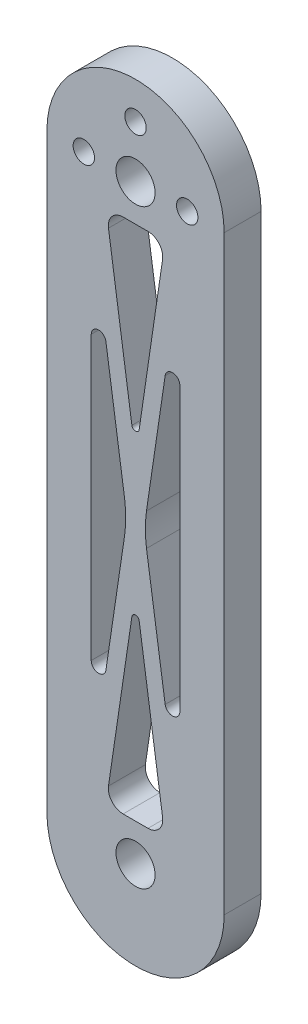
ISO-10303-21;
HEADER;
FILE_DESCRIPTION(('STEP AP214'),'2;1');
FILE_NAME('part.step','',(''),(''),'','','');
FILE_SCHEMA(('AUTOMOTIVE_DESIGN { 1 0 10303 214 1 1 1 1 }'));
ENDSEC;
DATA;
#1=APPLICATION_CONTEXT('core data for automotive mechanical design processes');
#2=APPLICATION_PROTOCOL_DEFINITION('international standard','automotive_design',2000,#1);
#3=PRODUCT_CONTEXT('',#1,'mechanical');
#4=PRODUCT('Part','Part','',(#3));
#5=PRODUCT_RELATED_PRODUCT_CATEGORY('part','',(#4));
#6=PRODUCT_DEFINITION_FORMATION('','',#4);
#7=PRODUCT_DEFINITION_CONTEXT('part definition',#1,'design');
#8=PRODUCT_DEFINITION('design','',#6,#7);
#9=PRODUCT_DEFINITION_SHAPE('','',#8);
#10=(LENGTH_UNIT() NAMED_UNIT(*) SI_UNIT(.MILLI.,.METRE.));
#11=(NAMED_UNIT(*) PLANE_ANGLE_UNIT() SI_UNIT($,.RADIAN.));
#12=(NAMED_UNIT(*) SI_UNIT($,.STERADIAN.) SOLID_ANGLE_UNIT());
#13=UNCERTAINTY_MEASURE_WITH_UNIT(LENGTH_MEASURE(1.E-05),#10,'distance_accuracy_value','');
#14=(GEOMETRIC_REPRESENTATION_CONTEXT(3) GLOBAL_UNCERTAINTY_ASSIGNED_CONTEXT((#13)) GLOBAL_UNIT_ASSIGNED_CONTEXT((#10,
#11,#12)) REPRESENTATION_CONTEXT('',''));
#15=CARTESIAN_POINT('',(0.,0.,0.));
#16=DIRECTION('',(0.,0.,1.));
#17=DIRECTION('',(1.,0.,0.));
#18=AXIS2_PLACEMENT_3D('',#15,#16,#17);
#19=CARTESIAN_POINT('',(0.,-40.,5.));
#20=DIRECTION('',(0.,0.,1.));
#21=DIRECTION('',(1.,0.,0.));
#22=AXIS2_PLACEMENT_3D('',#19,#20,#21);
#23=PLANE('',#22);
#24=CARTESIAN_POINT('',(-7.,40.,5.));
#25=DIRECTION('',(0.,0.,1.));
#26=DIRECTION('',(1.,0.,0.));
#27=AXIS2_PLACEMENT_3D('',#24,#25,#26);
#28=CIRCLE('',#27,1.45);
#29=CARTESIAN_POINT('',(-5.55,40.,5.));
#30=VERTEX_POINT('',#29);
#31=EDGE_CURVE('E411',#30,#30,#28,.T.);
#32=ORIENTED_EDGE('',*,*,#31,.F.);
#33=EDGE_LOOP('',(#32));
#34=FACE_BOUND('',#33,.T.);
#35=CARTESIAN_POINT('',(0.,-40.,5.));
#36=DIRECTION('',(0.,0.,1.));
#37=DIRECTION('',(1.,0.,0.));
#38=AXIS2_PLACEMENT_3D('',#35,#36,#37);
#39=CIRCLE('',#38,2.65);
#40=CARTESIAN_POINT('',(2.65,-40.,5.));
#41=VERTEX_POINT('',#40);
#42=EDGE_CURVE('E423',#41,#41,#39,.T.);
#43=ORIENTED_EDGE('',*,*,#42,.F.);
#44=EDGE_LOOP('',(#43));
#45=FACE_BOUND('',#44,.T.);
#46=CARTESIAN_POINT('',(0.,-40.,5.));
#47=DIRECTION('',(0.,0.,1.));
#48=DIRECTION('',(1.,0.,0.));
#49=AXIS2_PLACEMENT_3D('',#46,#47,#48);
#50=CIRCLE('',#49,12.);
#51=CARTESIAN_POINT('',(-12.,-40.,5.));
#52=VERTEX_POINT('',#51);
#53=CARTESIAN_POINT('',(12.,-40.,5.));
#54=VERTEX_POINT('',#53);
#55=EDGE_CURVE('E435',#52,#54,#50,.T.);
#56=ORIENTED_EDGE('',*,*,#55,.T.);
#57=DIRECTION('',(0.,1.,0.));
#58=VECTOR('',#57,1.);
#59=CARTESIAN_POINT('',(12.,40.,5.));
#60=LINE('',#59,#58);
#61=CARTESIAN_POINT('',(12.,40.,5.));
#62=VERTEX_POINT('',#61);
#63=EDGE_CURVE('E438',#54,#62,#60,.T.);
#64=ORIENTED_EDGE('',*,*,#63,.T.);
#65=CARTESIAN_POINT('',(0.,40.,5.));
#66=DIRECTION('',(0.,0.,1.));
#67=DIRECTION('',(1.,0.,0.));
#68=AXIS2_PLACEMENT_3D('',#65,#66,#67);
#69=CIRCLE('',#68,12.);
#70=CARTESIAN_POINT('',(-12.,40.,5.));
#71=VERTEX_POINT('',#70);
#72=EDGE_CURVE('E441',#62,#71,#69,.T.);
#73=ORIENTED_EDGE('',*,*,#72,.T.);
#74=DIRECTION('',(0.,-1.,0.));
#75=VECTOR('',#74,1.);
#76=CARTESIAN_POINT('',(-12.,40.,5.));
#77=LINE('',#76,#75);
#78=EDGE_CURVE('E443',#71,#52,#77,.T.);
#79=ORIENTED_EDGE('',*,*,#78,.T.);
#80=EDGE_LOOP('',(#56,#64,#73,#79));
#81=FACE_BOUND('',#80,.T.);
#82=CARTESIAN_POINT('',(0.,40.,5.));
#83=DIRECTION('',(0.,0.,1.));
#84=DIRECTION('',(1.,0.,0.));
#85=AXIS2_PLACEMENT_3D('',#82,#83,#84);
#86=CIRCLE('',#85,2.65);
#87=CARTESIAN_POINT('',(2.65,40.,5.));
#88=VERTEX_POINT('',#87);
#89=EDGE_CURVE('E429',#88,#88,#86,.T.);
#90=ORIENTED_EDGE('',*,*,#89,.F.);
#91=EDGE_LOOP('',(#90));
#92=FACE_BOUND('',#91,.T.);
#93=CARTESIAN_POINT('',(7.,40.,5.));
#94=DIRECTION('',(0.,0.,1.));
#95=DIRECTION('',(1.,0.,0.));
#96=AXIS2_PLACEMENT_3D('',#93,#94,#95);
#97=CIRCLE('',#96,1.45);
#98=CARTESIAN_POINT('',(8.45,40.,5.));
#99=VERTEX_POINT('',#98);
#100=EDGE_CURVE('E417',#99,#99,#97,.T.);
#101=ORIENTED_EDGE('',*,*,#100,.F.);
#102=EDGE_LOOP('',(#101));
#103=FACE_BOUND('',#102,.T.);
#104=CARTESIAN_POINT('',(0.,47.,5.));
#105=DIRECTION('',(0.,0.,1.));
#106=DIRECTION('',(1.,0.,0.));
#107=AXIS2_PLACEMENT_3D('',#104,#105,#106);
#108=CIRCLE('',#107,1.45);
#109=CARTESIAN_POINT('',(1.45,47.,5.));
#110=VERTEX_POINT('',#109);
#111=EDGE_CURVE('E405',#110,#110,#108,.T.);
#112=ORIENTED_EDGE('',*,*,#111,.F.);
#113=EDGE_LOOP('',(#112));
#114=FACE_BOUND('',#113,.T.);
#115=DIRECTION('',(0.,1.,0.));
#116=VECTOR('',#115,1.);
#117=CARTESIAN_POINT('',(6.00000000000021,19.0957813446483,5.));
#118=LINE('',#117,#116);
#119=CARTESIAN_POINT('',(6.00000000000005,-19.1632564122171,5.));
#120=VERTEX_POINT('',#119);
#121=CARTESIAN_POINT('',(6.0000000000002,19.0957813446483,5.));
#122=VERTEX_POINT('',#121);
#123=EDGE_CURVE('E362',#120,#122,#118,.T.);
#124=ORIENTED_EDGE('',*,*,#123,.F.);
#125=CARTESIAN_POINT('',(5.00000000000005,-19.1632564122178,5.));
#126=DIRECTION('',(0.,0.,1.));
#127=DIRECTION('',(1.,0.,0.));
#128=AXIS2_PLACEMENT_3D('',#125,#126,#127);
#129=CIRCLE('',#128,0.99999999999992);
#130=CARTESIAN_POINT('',(4.01084286011318,-19.3101174097989,5.));
#131=VERTEX_POINT('',#130);
#132=EDGE_CURVE('E360',#131,#120,#129,.T.);
#133=ORIENTED_EDGE('',*,*,#132,.F.);
#134=DIRECTION('',(0.14686099758108,-0.98915713988703,0.));
#135=VECTOR('',#134,1.);
#136=CARTESIAN_POINT('',(4.01084286011318,-19.3101174097989,5.));
#137=LINE('',#136,#135);
#138=CARTESIAN_POINT('',(1.48241939604228,-2.28035346064101,5.));
#139=VERTEX_POINT('',#138);
#140=EDGE_CURVE('E372',#139,#131,#137,.T.);
#141=ORIENTED_EDGE('',*,*,#140,.F.);
#142=CARTESIAN_POINT('',(16.3197764943478,-0.0774384969248615,5.));
#143=DIRECTION('',(0.,0.,1.));
#144=DIRECTION('',(-1.,0.,0.));
#145=AXIS2_PLACEMENT_3D('',#142,#143,#144);
#146=CIRCLE('',#145,15.);
#147=CARTESIAN_POINT('',(1.48078976209683,2.11447225857628,5.));
#148=VERTEX_POINT('',#147);
#149=EDGE_CURVE('E369',#148,#139,#146,.T.);
#150=ORIENTED_EDGE('',*,*,#149,.F.);
#151=DIRECTION('',(-0.146127383700074,-0.989265782150061,0.));
#152=VECTOR('',#151,1.);
#153=CARTESIAN_POINT('',(4.01073421785015,19.2419087283484,5.));
#154=LINE('',#153,#152);
#155=CARTESIAN_POINT('',(4.01073421785015,19.2419087283484,5.));
#156=VERTEX_POINT('',#155);
#157=EDGE_CURVE('E367',#156,#148,#154,.T.);
#158=ORIENTED_EDGE('',*,*,#157,.F.);
#159=CARTESIAN_POINT('',(5.0000000000002,19.0957813446483,5.));
#160=DIRECTION('',(0.,0.,1.));
#161=DIRECTION('',(-1.,0.,0.));
#162=AXIS2_PLACEMENT_3D('',#159,#160,#161);
#163=CIRCLE('',#162,1.);
#164=EDGE_CURVE('E365',#122,#156,#163,.T.);
#165=ORIENTED_EDGE('',*,*,#164,.F.);
#166=EDGE_LOOP('',(#124,#133,#141,#150,#158,#165));
#167=FACE_BOUND('',#166,.T.);
#168=DIRECTION('',(0.14686099758049,0.989157139887118,0.));
#169=VECTOR('',#168,1.);
#170=CARTESIAN_POINT('',(-1.48241939605015,-2.28035346057146,5.));
#171=LINE('',#170,#169);
#172=CARTESIAN_POINT('',(-4.01084286011281,-19.3101174097437,5.));
#173=VERTEX_POINT('',#172);
#174=CARTESIAN_POINT('',(-1.48241939605014,-2.28035346057146,5.));
#175=VERTEX_POINT('',#174);
#176=EDGE_CURVE('E317',#173,#175,#171,.T.);
#177=ORIENTED_EDGE('',*,*,#176,.F.);
#178=CARTESIAN_POINT('',(-5.00000000000002,-19.1632564121639,5.));
#179=DIRECTION('',(0.,0.,1.));
#180=DIRECTION('',(1.,0.,0.));
#181=AXIS2_PLACEMENT_3D('',#178,#179,#180);
#182=CIRCLE('',#181,1.);
#183=CARTESIAN_POINT('',(-6.00000000000002,-19.1632564121632,5.));
#184=VERTEX_POINT('',#183);
#185=EDGE_CURVE('E315',#184,#173,#182,.T.);
#186=ORIENTED_EDGE('',*,*,#185,.F.);
#187=DIRECTION('',(0.,-1.,0.));
#188=VECTOR('',#187,1.);
#189=CARTESIAN_POINT('',(-6.00000000000002,-19.1632564121632,5.));
#190=LINE('',#189,#188);
#191=CARTESIAN_POINT('',(-6.00000000000027,19.0957813446471,5.));
#192=VERTEX_POINT('',#191);
#193=EDGE_CURVE('E327',#192,#184,#190,.T.);
#194=ORIENTED_EDGE('',*,*,#193,.F.);
#195=CARTESIAN_POINT('',(-5.00000000000027,19.0957813446478,5.));
#196=DIRECTION('',(0.,0.,1.));
#197=DIRECTION('',(-1.,0.,0.));
#198=AXIS2_PLACEMENT_3D('',#195,#196,#197);
#199=CIRCLE('',#198,1.00000000000012);
#200=CARTESIAN_POINT('',(-4.01073421785008,19.2419087283478,5.));
#201=VERTEX_POINT('',#200);
#202=EDGE_CURVE('E324',#201,#192,#199,.T.);
#203=ORIENTED_EDGE('',*,*,#202,.F.);
#204=DIRECTION('',(-0.146127383700058,0.989265782150063,0.));
#205=VECTOR('',#204,1.);
#206=CARTESIAN_POINT('',(-1.48078976210594,2.11447225863689,5.));
#207=LINE('',#206,#205);
#208=CARTESIAN_POINT('',(-1.48078976210594,2.11447225863689,5.));
#209=VERTEX_POINT('',#208);
#210=EDGE_CURVE('E322',#209,#201,#207,.T.);
#211=ORIENTED_EDGE('',*,*,#210,.F.);
#212=CARTESIAN_POINT('',(-16.3197764943568,-0.077438496863992,5.));
#213=DIRECTION('',(0.,0.,1.));
#214=DIRECTION('',(1.,0.,0.));
#215=AXIS2_PLACEMENT_3D('',#212,#213,#214);
#216=CIRCLE('',#215,14.9999999999999);
#217=EDGE_CURVE('E320',#175,#209,#216,.T.);
#218=ORIENTED_EDGE('',*,*,#217,.F.);
#219=EDGE_LOOP('',(#177,#186,#194,#203,#211,#218));
#220=FACE_BOUND('',#219,.T.);
#221=DIRECTION('',(1.,0.,0.));
#222=VECTOR('',#221,1.);
#223=CARTESIAN_POINT('',(-1.6843717320659,-35.,5.));
#224=LINE('',#223,#222);
#225=CARTESIAN_POINT('',(-1.6843717320659,-35.,5.));
#226=VERTEX_POINT('',#225);
#227=CARTESIAN_POINT('',(1.6843717320659,-35.,5.));
#228=VERTEX_POINT('',#227);
#229=EDGE_CURVE('E272',#226,#228,#224,.T.);
#230=ORIENTED_EDGE('',*,*,#229,.F.);
#231=CARTESIAN_POINT('',(-1.68437173206592,-33.,5.));
#232=DIRECTION('',(0.,0.,1.));
#233=DIRECTION('',(-1.,0.,0.));
#234=AXIS2_PLACEMENT_3D('',#231,#232,#233);
#235=CIRCLE('',#234,2.0000000000002);
#236=CARTESIAN_POINT('',(-3.66290329636644,-32.7077452325998,5.));
#237=VERTEX_POINT('',#236);
#238=EDGE_CURVE('E270',#237,#226,#235,.T.);
#239=ORIENTED_EDGE('',*,*,#238,.F.);
#240=DIRECTION('',(-0.146127383700074,-0.989265782150061,0.));
#241=VECTOR('',#240,1.);
#242=CARTESIAN_POINT('',(-0.494632891075225,-11.2589146219979,5.));
#243=LINE('',#242,#241);
#244=CARTESIAN_POINT('',(-0.494632891075229,-11.2589146219979,5.));
#245=VERTEX_POINT('',#244);
#246=EDGE_CURVE('E282',#245,#237,#243,.T.);
#247=ORIENTED_EDGE('',*,*,#246,.F.);
#248=CARTESIAN_POINT('',(0.,-11.3319783138479,5.));
#249=DIRECTION('',(0.,0.,1.));
#250=DIRECTION('',(-1.,0.,0.));
#251=AXIS2_PLACEMENT_3D('',#248,#249,#250);
#252=CIRCLE('',#251,0.499999999999972);
#253=CARTESIAN_POINT('',(0.49463289107479,-11.2589146219979,5.));
#254=VERTEX_POINT('',#253);
#255=EDGE_CURVE('E279',#254,#245,#252,.T.);
#256=ORIENTED_EDGE('',*,*,#255,.F.);
#257=DIRECTION('',(-0.146127383700057,0.989265782150063,0.));
#258=VECTOR('',#257,1.);
#259=CARTESIAN_POINT('',(0.49463289107479,-11.2589146219979,5.));
#260=LINE('',#259,#258);
#261=CARTESIAN_POINT('',(3.66290329636585,-32.7077452325999,5.));
#262=VERTEX_POINT('',#261);
#263=EDGE_CURVE('E277',#262,#254,#260,.T.);
#264=ORIENTED_EDGE('',*,*,#263,.F.);
#265=CARTESIAN_POINT('',(1.68437173206592,-33.,5.));
#266=DIRECTION('',(0.,0.,1.));
#267=DIRECTION('',(-1.,0.,0.));
#268=AXIS2_PLACEMENT_3D('',#265,#266,#267);
#269=CIRCLE('',#268,1.99999999999981);
#270=EDGE_CURVE('E275',#228,#262,#269,.T.);
#271=ORIENTED_EDGE('',*,*,#270,.F.);
#272=EDGE_LOOP('',(#230,#239,#247,#256,#264,#271));
#273=FACE_BOUND('',#272,.T.);
#274=DIRECTION('',(0.145493990494669,-0.989359135364877,0.));
#275=VECTOR('',#274,1.);
#276=CARTESIAN_POINT('',(-3.66309000279215,32.7090120190112,5.));
#277=LINE('',#276,#275);
#278=CARTESIAN_POINT('',(-3.66309000279215,32.7090120190112,5.));
#279=VERTEX_POINT('',#278);
#280=CARTESIAN_POINT('',(-0.494679567682443,11.1638210602406,5.));
#281=VERTEX_POINT('',#280);
#282=EDGE_CURVE('E227',#279,#281,#277,.T.);
#283=ORIENTED_EDGE('',*,*,#282,.F.);
#284=CARTESIAN_POINT('',(-1.6843717320624,33.0000000000005,5.));
#285=DIRECTION('',(0.,0.,1.));
#286=DIRECTION('',(-1.,0.,0.));
#287=AXIS2_PLACEMENT_3D('',#284,#285,#286);
#288=CIRCLE('',#287,1.99999999999974);
#289=CARTESIAN_POINT('',(-1.6843717320624,35.,5.));
#290=VERTEX_POINT('',#289);
#291=EDGE_CURVE('E219',#290,#279,#288,.T.);
#292=ORIENTED_EDGE('',*,*,#291,.F.);
#293=DIRECTION('',(-1.,0.,0.));
#294=VECTOR('',#293,1.);
#295=CARTESIAN_POINT('',(-1.6843717320624,35.,5.));
#296=LINE('',#295,#294);
#297=CARTESIAN_POINT('',(1.6843717320624,35.,5.));
#298=VERTEX_POINT('',#297);
#299=EDGE_CURVE('E248',#298,#290,#296,.T.);
#300=ORIENTED_EDGE('',*,*,#299,.F.);
#301=CARTESIAN_POINT('',(1.6843717320624,33.0000000000005,5.));
#302=DIRECTION('',(0.,0.,1.));
#303=DIRECTION('',(1.,0.,0.));
#304=AXIS2_PLACEMENT_3D('',#301,#302,#303);
#305=CIRCLE('',#304,1.99999999999974);
#306=CARTESIAN_POINT('',(3.66309000279214,32.7090120190112,5.));
#307=VERTEX_POINT('',#306);
#308=EDGE_CURVE('E246',#307,#298,#305,.T.);
#309=ORIENTED_EDGE('',*,*,#308,.F.);
#310=DIRECTION('',(0.145493990494669,0.989359135364877,0.));
#311=VECTOR('',#310,1.);
#312=CARTESIAN_POINT('',(3.66309000279214,32.7090120190112,5.));
#313=LINE('',#312,#311);
#314=CARTESIAN_POINT('',(0.494679567682434,11.1638210602406,5.));
#315=VERTEX_POINT('',#314);
#316=EDGE_CURVE('E242',#315,#307,#313,.T.);
#317=ORIENTED_EDGE('',*,*,#316,.F.);
#318=CARTESIAN_POINT('',(0.,11.2365680554879,5.));
#319=DIRECTION('',(0.,0.,1.));
#320=DIRECTION('',(1.,0.,0.));
#321=AXIS2_PLACEMENT_3D('',#318,#319,#320);
#322=CIRCLE('',#321,0.5);
#323=EDGE_CURVE('E240',#281,#315,#322,.T.);
#324=ORIENTED_EDGE('',*,*,#323,.F.);
#325=EDGE_LOOP('',(#283,#292,#300,#309,#317,#324));
#326=FACE_BOUND('',#325,.T.);
#327=ADVANCED_FACE('F34',(#34,#45,#81,#92,#103,#114,#167,#220,#273,#326),#23,.T.);
#328=CARTESIAN_POINT('',(0.,-40.,0.));
#329=DIRECTION('',(0.,0.,1.));
#330=DIRECTION('',(1.,0.,0.));
#331=AXIS2_PLACEMENT_3D('',#328,#329,#330);
#332=PLANE('',#331);
#333=CARTESIAN_POINT('',(-1.68437173206592,-33.,0.));
#334=DIRECTION('',(0.,0.,1.));
#335=DIRECTION('',(-1.,0.,0.));
#336=AXIS2_PLACEMENT_3D('',#333,#334,#335);
#337=CIRCLE('',#336,2.0000000000002);
#338=CARTESIAN_POINT('',(-3.66290329636644,-32.7077452325998,0.));
#339=VERTEX_POINT('',#338);
#340=CARTESIAN_POINT('',(-1.6843717320659,-35.,0.));
#341=VERTEX_POINT('',#340);
#342=EDGE_CURVE('E235',#339,#341,#337,.T.);
#343=ORIENTED_EDGE('',*,*,#342,.T.);
#344=DIRECTION('',(1.,0.,0.));
#345=VECTOR('',#344,1.);
#346=CARTESIAN_POINT('',(-1.6843717320659,-35.,0.));
#347=LINE('',#346,#345);
#348=CARTESIAN_POINT('',(1.6843717320659,-35.,0.));
#349=VERTEX_POINT('',#348);
#350=EDGE_CURVE('E287',#341,#349,#347,.T.);
#351=ORIENTED_EDGE('',*,*,#350,.T.);
#352=CARTESIAN_POINT('',(1.68437173206592,-33.,0.));
#353=DIRECTION('',(0.,0.,1.));
#354=DIRECTION('',(-1.,0.,0.));
#355=AXIS2_PLACEMENT_3D('',#352,#353,#354);
#356=CIRCLE('',#355,1.99999999999981);
#357=CARTESIAN_POINT('',(3.66290329636585,-32.7077452325999,0.));
#358=VERTEX_POINT('',#357);
#359=EDGE_CURVE('E290',#349,#358,#356,.T.);
#360=ORIENTED_EDGE('',*,*,#359,.T.);
#361=DIRECTION('',(-0.146127383700057,0.989265782150063,0.));
#362=VECTOR('',#361,1.);
#363=CARTESIAN_POINT('',(0.49463289107479,-11.2589146219979,0.));
#364=LINE('',#363,#362);
#365=CARTESIAN_POINT('',(0.49463289107479,-11.2589146219979,0.));
#366=VERTEX_POINT('',#365);
#367=EDGE_CURVE('E293',#358,#366,#364,.T.);
#368=ORIENTED_EDGE('',*,*,#367,.T.);
#369=CARTESIAN_POINT('',(0.,-11.3319783138479,0.));
#370=DIRECTION('',(0.,0.,1.));
#371=DIRECTION('',(-1.,0.,0.));
#372=AXIS2_PLACEMENT_3D('',#369,#370,#371);
#373=CIRCLE('',#372,0.499999999999972);
#374=CARTESIAN_POINT('',(-0.494632891075011,-11.2589146219979,0.));
#375=VERTEX_POINT('',#374);
#376=EDGE_CURVE('E296',#366,#375,#373,.T.);
#377=ORIENTED_EDGE('',*,*,#376,.T.);
#378=DIRECTION('',(-0.146127383700074,-0.989265782150061,0.));
#379=VECTOR('',#378,1.);
#380=CARTESIAN_POINT('',(-0.494632891075225,-11.2589146219979,0.));
#381=LINE('',#380,#379);
#382=EDGE_CURVE('E273',#375,#339,#381,.T.);
#383=ORIENTED_EDGE('',*,*,#382,.T.);
#384=EDGE_LOOP('',(#343,#351,#360,#368,#377,#383));
#385=FACE_BOUND('',#384,.T.);
#386=CARTESIAN_POINT('',(5.00000000000005,-19.1632564122178,0.));
#387=DIRECTION('',(0.,0.,1.));
#388=DIRECTION('',(1.,0.,0.));
#389=AXIS2_PLACEMENT_3D('',#386,#387,#388);
#390=CIRCLE('',#389,0.99999999999992);
#391=CARTESIAN_POINT('',(4.01084286011318,-19.3101174097989,0.));
#392=VERTEX_POINT('',#391);
#393=CARTESIAN_POINT('',(6.00000000000005,-19.1632564122171,0.));
#394=VERTEX_POINT('',#393);
#395=EDGE_CURVE('E359',#392,#394,#390,.T.);
#396=ORIENTED_EDGE('',*,*,#395,.T.);
#397=DIRECTION('',(0.,1.,0.));
#398=VECTOR('',#397,1.);
#399=CARTESIAN_POINT('',(6.00000000000021,19.0957813446483,0.));
#400=LINE('',#399,#398);
#401=CARTESIAN_POINT('',(6.0000000000002,19.0957813446483,0.));
#402=VERTEX_POINT('',#401);
#403=EDGE_CURVE('E377',#394,#402,#400,.T.);
#404=ORIENTED_EDGE('',*,*,#403,.T.);
#405=CARTESIAN_POINT('',(5.0000000000002,19.0957813446483,0.));
#406=DIRECTION('',(0.,0.,1.));
#407=DIRECTION('',(-1.,0.,0.));
#408=AXIS2_PLACEMENT_3D('',#405,#406,#407);
#409=CIRCLE('',#408,1.);
#410=CARTESIAN_POINT('',(4.01073421785015,19.2419087283484,0.));
#411=VERTEX_POINT('',#410);
#412=EDGE_CURVE('E380',#402,#411,#409,.T.);
#413=ORIENTED_EDGE('',*,*,#412,.T.);
#414=DIRECTION('',(-0.146127383700074,-0.989265782150061,0.));
#415=VECTOR('',#414,1.);
#416=CARTESIAN_POINT('',(4.01073421785015,19.2419087283484,0.));
#417=LINE('',#416,#415);
#418=CARTESIAN_POINT('',(1.48078976209683,2.11447225857628,0.));
#419=VERTEX_POINT('',#418);
#420=EDGE_CURVE('E383',#411,#419,#417,.T.);
#421=ORIENTED_EDGE('',*,*,#420,.T.);
#422=CARTESIAN_POINT('',(16.3197764943478,-0.0774384969248615,0.));
#423=DIRECTION('',(0.,0.,1.));
#424=DIRECTION('',(-1.,0.,0.));
#425=AXIS2_PLACEMENT_3D('',#422,#423,#424);
#426=CIRCLE('',#425,15.);
#427=CARTESIAN_POINT('',(1.48241939604228,-2.28035346064102,0.));
#428=VERTEX_POINT('',#427);
#429=EDGE_CURVE('E386',#419,#428,#426,.T.);
#430=ORIENTED_EDGE('',*,*,#429,.T.);
#431=DIRECTION('',(0.14686099758108,-0.98915713988703,0.));
#432=VECTOR('',#431,1.);
#433=CARTESIAN_POINT('',(4.01084286011318,-19.3101174097989,0.));
#434=LINE('',#433,#432);
#435=EDGE_CURVE('E363',#428,#392,#434,.T.);
#436=ORIENTED_EDGE('',*,*,#435,.T.);
#437=EDGE_LOOP('',(#396,#404,#413,#421,#430,#436));
#438=FACE_BOUND('',#437,.T.);
#439=CARTESIAN_POINT('',(0.,-40.,0.));
#440=DIRECTION('',(0.,0.,1.));
#441=DIRECTION('',(1.,0.,0.));
#442=AXIS2_PLACEMENT_3D('',#439,#440,#441);
#443=CIRCLE('',#442,12.);
#444=CARTESIAN_POINT('',(-12.,-40.,0.));
#445=VERTEX_POINT('',#444);
#446=CARTESIAN_POINT('',(12.,-40.,0.));
#447=VERTEX_POINT('',#446);
#448=EDGE_CURVE('E432',#445,#447,#443,.T.);
#449=ORIENTED_EDGE('',*,*,#448,.F.);
#450=DIRECTION('',(0.,-1.,0.));
#451=VECTOR('',#450,1.);
#452=CARTESIAN_POINT('',(-12.,40.,0.));
#453=LINE('',#452,#451);
#454=CARTESIAN_POINT('',(-12.,40.,0.));
#455=VERTEX_POINT('',#454);
#456=EDGE_CURVE('E439',#455,#445,#453,.T.);
#457=ORIENTED_EDGE('',*,*,#456,.F.);
#458=CARTESIAN_POINT('',(0.,40.,0.));
#459=DIRECTION('',(0.,0.,1.));
#460=DIRECTION('',(1.,0.,0.));
#461=AXIS2_PLACEMENT_3D('',#458,#459,#460);
#462=CIRCLE('',#461,12.);
#463=CARTESIAN_POINT('',(12.,40.,0.));
#464=VERTEX_POINT('',#463);
#465=EDGE_CURVE('E450',#464,#455,#462,.T.);
#466=ORIENTED_EDGE('',*,*,#465,.F.);
#467=DIRECTION('',(0.,1.,0.));
#468=VECTOR('',#467,1.);
#469=CARTESIAN_POINT('',(12.,40.,0.));
#470=LINE('',#469,#468);
#471=EDGE_CURVE('E448',#447,#464,#470,.T.);
#472=ORIENTED_EDGE('',*,*,#471,.F.);
#473=EDGE_LOOP('',(#449,#457,#466,#472));
#474=FACE_BOUND('',#473,.T.);
#475=CARTESIAN_POINT('',(0.,40.,0.));
#476=DIRECTION('',(0.,0.,1.));
#477=DIRECTION('',(1.,0.,0.));
#478=AXIS2_PLACEMENT_3D('',#475,#476,#477);
#479=CIRCLE('',#478,2.65);
#480=CARTESIAN_POINT('',(2.65,40.,0.));
#481=VERTEX_POINT('',#480);
#482=EDGE_CURVE('E426',#481,#481,#479,.T.);
#483=ORIENTED_EDGE('',*,*,#482,.T.);
#484=EDGE_LOOP('',(#483));
#485=FACE_BOUND('',#484,.T.);
#486=CARTESIAN_POINT('',(0.,-40.,0.));
#487=DIRECTION('',(0.,0.,1.));
#488=DIRECTION('',(1.,0.,0.));
#489=AXIS2_PLACEMENT_3D('',#486,#487,#488);
#490=CIRCLE('',#489,2.65);
#491=CARTESIAN_POINT('',(2.65,-40.,0.));
#492=VERTEX_POINT('',#491);
#493=EDGE_CURVE('E420',#492,#492,#490,.T.);
#494=ORIENTED_EDGE('',*,*,#493,.T.);
#495=EDGE_LOOP('',(#494));
#496=FACE_BOUND('',#495,.T.);
#497=CARTESIAN_POINT('',(7.,40.,0.));
#498=DIRECTION('',(0.,0.,1.));
#499=DIRECTION('',(1.,0.,0.));
#500=AXIS2_PLACEMENT_3D('',#497,#498,#499);
#501=CIRCLE('',#500,1.45);
#502=CARTESIAN_POINT('',(8.45,40.,0.));
#503=VERTEX_POINT('',#502);
#504=EDGE_CURVE('E414',#503,#503,#501,.T.);
#505=ORIENTED_EDGE('',*,*,#504,.T.);
#506=EDGE_LOOP('',(#505));
#507=FACE_BOUND('',#506,.T.);
#508=CARTESIAN_POINT('',(-7.,40.,0.));
#509=DIRECTION('',(0.,0.,1.));
#510=DIRECTION('',(1.,0.,0.));
#511=AXIS2_PLACEMENT_3D('',#508,#509,#510);
#512=CIRCLE('',#511,1.45);
#513=CARTESIAN_POINT('',(-5.55,40.,0.));
#514=VERTEX_POINT('',#513);
#515=EDGE_CURVE('E408',#514,#514,#512,.T.);
#516=ORIENTED_EDGE('',*,*,#515,.T.);
#517=EDGE_LOOP('',(#516));
#518=FACE_BOUND('',#517,.T.);
#519=CARTESIAN_POINT('',(0.,47.,0.));
#520=DIRECTION('',(0.,0.,1.));
#521=DIRECTION('',(1.,0.,0.));
#522=AXIS2_PLACEMENT_3D('',#519,#520,#521);
#523=CIRCLE('',#522,1.45);
#524=CARTESIAN_POINT('',(1.45,47.,0.));
#525=VERTEX_POINT('',#524);
#526=EDGE_CURVE('E404',#525,#525,#523,.T.);
#527=ORIENTED_EDGE('',*,*,#526,.T.);
#528=EDGE_LOOP('',(#527));
#529=FACE_BOUND('',#528,.T.);
#530=CARTESIAN_POINT('',(-5.00000000000002,-19.1632564121639,0.));
#531=DIRECTION('',(0.,0.,1.));
#532=DIRECTION('',(1.,0.,0.));
#533=AXIS2_PLACEMENT_3D('',#530,#531,#532);
#534=CIRCLE('',#533,1.);
#535=CARTESIAN_POINT('',(-6.00000000000002,-19.1632564121632,0.));
#536=VERTEX_POINT('',#535);
#537=CARTESIAN_POINT('',(-4.01084286011281,-19.3101174097437,0.));
#538=VERTEX_POINT('',#537);
#539=EDGE_CURVE('E314',#536,#538,#534,.T.);
#540=ORIENTED_EDGE('',*,*,#539,.T.);
#541=DIRECTION('',(0.14686099758049,0.989157139887118,0.));
#542=VECTOR('',#541,1.);
#543=CARTESIAN_POINT('',(-1.48241939605015,-2.28035346057146,0.));
#544=LINE('',#543,#542);
#545=CARTESIAN_POINT('',(-1.48241939605014,-2.28035346057146,0.));
#546=VERTEX_POINT('',#545);
#547=EDGE_CURVE('E332',#538,#546,#544,.T.);
#548=ORIENTED_EDGE('',*,*,#547,.T.);
#549=CARTESIAN_POINT('',(-16.3197764943568,-0.077438496863992,0.));
#550=DIRECTION('',(0.,0.,1.));
#551=DIRECTION('',(1.,0.,0.));
#552=AXIS2_PLACEMENT_3D('',#549,#550,#551);
#553=CIRCLE('',#552,14.9999999999999);
#554=CARTESIAN_POINT('',(-1.48078976210594,2.11447225863689,0.));
#555=VERTEX_POINT('',#554);
#556=EDGE_CURVE('E335',#546,#555,#553,.T.);
#557=ORIENTED_EDGE('',*,*,#556,.T.);
#558=DIRECTION('',(-0.146127383700058,0.989265782150063,0.));
#559=VECTOR('',#558,1.);
#560=CARTESIAN_POINT('',(-1.48078976210594,2.11447225863689,0.));
#561=LINE('',#560,#559);
#562=CARTESIAN_POINT('',(-4.01073421785008,19.2419087283478,0.));
#563=VERTEX_POINT('',#562);
#564=EDGE_CURVE('E338',#555,#563,#561,.T.);
#565=ORIENTED_EDGE('',*,*,#564,.T.);
#566=CARTESIAN_POINT('',(-5.00000000000027,19.0957813446478,0.));
#567=DIRECTION('',(0.,0.,1.));
#568=DIRECTION('',(-1.,0.,0.));
#569=AXIS2_PLACEMENT_3D('',#566,#567,#568);
#570=CIRCLE('',#569,1.00000000000012);
#571=CARTESIAN_POINT('',(-6.00000000000027,19.0957813446471,0.));
#572=VERTEX_POINT('',#571);
#573=EDGE_CURVE('E341',#563,#572,#570,.T.);
#574=ORIENTED_EDGE('',*,*,#573,.T.);
#575=DIRECTION('',(0.,-1.,0.));
#576=VECTOR('',#575,1.);
#577=CARTESIAN_POINT('',(-6.00000000000002,-19.1632564121632,0.));
#578=LINE('',#577,#576);
#579=EDGE_CURVE('E318',#572,#536,#578,.T.);
#580=ORIENTED_EDGE('',*,*,#579,.T.);
#581=EDGE_LOOP('',(#540,#548,#557,#565,#574,#580));
#582=FACE_BOUND('',#581,.T.);
#583=CARTESIAN_POINT('',(-1.6843717320624,33.0000000000005,0.));
#584=DIRECTION('',(0.,0.,1.));
#585=DIRECTION('',(-1.,0.,0.));
#586=AXIS2_PLACEMENT_3D('',#583,#584,#585);
#587=CIRCLE('',#586,1.99999999999974);
#588=CARTESIAN_POINT('',(-1.6843717320624,35.,0.));
#589=VERTEX_POINT('',#588);
#590=CARTESIAN_POINT('',(-3.66309000279215,32.7090120190112,0.));
#591=VERTEX_POINT('',#590);
#592=EDGE_CURVE('E57',#589,#591,#587,.T.);
#593=ORIENTED_EDGE('',*,*,#592,.T.);
#594=DIRECTION('',(0.145493990494669,-0.989359135364877,0.));
#595=VECTOR('',#594,1.);
#596=CARTESIAN_POINT('',(-3.66309000279215,32.7090120190112,0.));
#597=LINE('',#596,#595);
#598=CARTESIAN_POINT('',(-0.494679567682443,11.1638210602406,0.));
#599=VERTEX_POINT('',#598);
#600=EDGE_CURVE('E234',#591,#599,#597,.T.);
#601=ORIENTED_EDGE('',*,*,#600,.T.);
#602=CARTESIAN_POINT('',(0.,11.2365680554879,0.));
#603=DIRECTION('',(0.,0.,1.));
#604=DIRECTION('',(1.,0.,0.));
#605=AXIS2_PLACEMENT_3D('',#602,#603,#604);
#606=CIRCLE('',#605,0.5);
#607=CARTESIAN_POINT('',(0.494679567682434,11.1638210602406,0.));
#608=VERTEX_POINT('',#607);
#609=EDGE_CURVE('E252',#599,#608,#606,.T.);
#610=ORIENTED_EDGE('',*,*,#609,.T.);
#611=DIRECTION('',(0.145493990494669,0.989359135364877,0.));
#612=VECTOR('',#611,1.);
#613=CARTESIAN_POINT('',(3.66309000279214,32.7090120190112,0.));
#614=LINE('',#613,#612);
#615=CARTESIAN_POINT('',(3.66309000279214,32.7090120190112,0.));
#616=VERTEX_POINT('',#615);
#617=EDGE_CURVE('E255',#608,#616,#614,.T.);
#618=ORIENTED_EDGE('',*,*,#617,.T.);
#619=CARTESIAN_POINT('',(1.6843717320624,33.0000000000005,0.));
#620=DIRECTION('',(0.,0.,1.));
#621=DIRECTION('',(1.,0.,0.));
#622=AXIS2_PLACEMENT_3D('',#619,#620,#621);
#623=CIRCLE('',#622,1.99999999999974);
#624=CARTESIAN_POINT('',(1.6843717320624,35.0000000000003,0.));
#625=VERTEX_POINT('',#624);
#626=EDGE_CURVE('E258',#616,#625,#623,.T.);
#627=ORIENTED_EDGE('',*,*,#626,.T.);
#628=DIRECTION('',(-1.,0.,0.));
#629=VECTOR('',#628,1.);
#630=CARTESIAN_POINT('',(-1.6843717320624,35.,0.));
#631=LINE('',#630,#629);
#632=EDGE_CURVE('E228',#625,#589,#631,.T.);
#633=ORIENTED_EDGE('',*,*,#632,.T.);
#634=EDGE_LOOP('',(#593,#601,#610,#618,#627,#633));
#635=FACE_BOUND('',#634,.T.);
#636=ADVANCED_FACE('F468',(#385,#438,#474,#485,#496,#507,#518,#529,#582,#635),#332,.F.);
#637=CARTESIAN_POINT('',(0.,-40.,5.));
#638=DIRECTION('',(0.,0.,-1.));
#639=DIRECTION('',(-1.,0.,0.));
#640=AXIS2_PLACEMENT_3D('',#637,#638,#639);
#641=CYLINDRICAL_SURFACE('',#640,12.);
#642=ORIENTED_EDGE('',*,*,#448,.T.);
#643=DIRECTION('',(0.,0.,-1.));
#644=VECTOR('',#643,1.);
#645=CARTESIAN_POINT('',(12.,-40.,5.));
#646=LINE('',#645,#644);
#647=EDGE_CURVE('E11',#54,#447,#646,.T.);
#648=ORIENTED_EDGE('',*,*,#647,.F.);
#649=ORIENTED_EDGE('',*,*,#55,.F.);
#650=DIRECTION('',(0.,0.,-1.));
#651=VECTOR('',#650,1.);
#652=CARTESIAN_POINT('',(-12.,-40.,5.));
#653=LINE('',#652,#651);
#654=EDGE_CURVE('E445',#52,#445,#653,.T.);
#655=ORIENTED_EDGE('',*,*,#654,.T.);
#656=EDGE_LOOP('',(#642,#648,#649,#655));
#657=FACE_BOUND('',#656,.T.);
#658=ADVANCED_FACE('F36',(#657),#641,.T.);
#659=CARTESIAN_POINT('',(12.,40.,5.));
#660=DIRECTION('',(-1.,0.,0.));
#661=DIRECTION('',(0.,-1.,0.));
#662=AXIS2_PLACEMENT_3D('',#659,#660,#661);
#663=PLANE('',#662);
#664=ORIENTED_EDGE('',*,*,#471,.T.);
#665=DIRECTION('',(0.,0.,-1.));
#666=VECTOR('',#665,1.);
#667=CARTESIAN_POINT('',(12.,40.,5.));
#668=LINE('',#667,#666);
#669=EDGE_CURVE('E42',#62,#464,#668,.T.);
#670=ORIENTED_EDGE('',*,*,#669,.F.);
#671=ORIENTED_EDGE('',*,*,#63,.F.);
#672=ORIENTED_EDGE('',*,*,#647,.T.);
#673=EDGE_LOOP('',(#664,#670,#671,#672));
#674=FACE_BOUND('',#673,.T.);
#675=ADVANCED_FACE('F479',(#674),#663,.F.);
#676=CARTESIAN_POINT('',(0.,40.,5.));
#677=DIRECTION('',(0.,0.,-1.));
#678=DIRECTION('',(-1.,0.,0.));
#679=AXIS2_PLACEMENT_3D('',#676,#677,#678);
#680=CYLINDRICAL_SURFACE('',#679,12.);
#681=ORIENTED_EDGE('',*,*,#465,.T.);
#682=DIRECTION('',(0.,0.,-1.));
#683=VECTOR('',#682,1.);
#684=CARTESIAN_POINT('',(-12.,40.,5.));
#685=LINE('',#684,#683);
#686=EDGE_CURVE('E455',#71,#455,#685,.T.);
#687=ORIENTED_EDGE('',*,*,#686,.F.);
#688=ORIENTED_EDGE('',*,*,#72,.F.);
#689=ORIENTED_EDGE('',*,*,#669,.T.);
#690=EDGE_LOOP('',(#681,#687,#688,#689));
#691=FACE_BOUND('',#690,.T.);
#692=ADVANCED_FACE('F462',(#691),#680,.T.);
#693=CARTESIAN_POINT('',(-12.,40.,5.));
#694=DIRECTION('',(1.,0.,0.));
#695=DIRECTION('',(0.,0.,-1.));
#696=AXIS2_PLACEMENT_3D('',#693,#694,#695);
#697=PLANE('',#696);
#698=ORIENTED_EDGE('',*,*,#456,.T.);
#699=ORIENTED_EDGE('',*,*,#654,.F.);
#700=ORIENTED_EDGE('',*,*,#78,.F.);
#701=ORIENTED_EDGE('',*,*,#686,.T.);
#702=EDGE_LOOP('',(#698,#699,#700,#701));
#703=FACE_BOUND('',#702,.T.);
#704=ADVANCED_FACE('F472',(#703),#697,.F.);
#705=CARTESIAN_POINT('',(0.,40.,5.));
#706=DIRECTION('',(0.,0.,-1.));
#707=DIRECTION('',(-1.,0.,0.));
#708=AXIS2_PLACEMENT_3D('',#705,#706,#707);
#709=CYLINDRICAL_SURFACE('',#708,2.65);
#710=ORIENTED_EDGE('',*,*,#89,.T.);
#711=EDGE_LOOP('',(#710));
#712=FACE_BOUND('',#711,.T.);
#713=ORIENTED_EDGE('',*,*,#482,.F.);
#714=EDGE_LOOP('',(#713));
#715=FACE_BOUND('',#714,.T.);
#716=ADVANCED_FACE('F497',(#712,#715),#709,.F.);
#717=CARTESIAN_POINT('',(0.,-40.,5.));
#718=DIRECTION('',(0.,0.,-1.));
#719=DIRECTION('',(-1.,0.,0.));
#720=AXIS2_PLACEMENT_3D('',#717,#718,#719);
#721=CYLINDRICAL_SURFACE('',#720,2.65);
#722=ORIENTED_EDGE('',*,*,#42,.T.);
#723=EDGE_LOOP('',(#722));
#724=FACE_BOUND('',#723,.T.);
#725=ORIENTED_EDGE('',*,*,#493,.F.);
#726=EDGE_LOOP('',(#725));
#727=FACE_BOUND('',#726,.T.);
#728=ADVANCED_FACE('F504',(#724,#727),#721,.F.);
#729=CARTESIAN_POINT('',(7.,40.,5.));
#730=DIRECTION('',(0.,0.,-1.));
#731=DIRECTION('',(-1.,0.,0.));
#732=AXIS2_PLACEMENT_3D('',#729,#730,#731);
#733=CYLINDRICAL_SURFACE('',#732,1.45);
#734=ORIENTED_EDGE('',*,*,#100,.T.);
#735=EDGE_LOOP('',(#734));
#736=FACE_BOUND('',#735,.T.);
#737=ORIENTED_EDGE('',*,*,#504,.F.);
#738=EDGE_LOOP('',(#737));
#739=FACE_BOUND('',#738,.T.);
#740=ADVANCED_FACE('F509',(#736,#739),#733,.F.);
#741=CARTESIAN_POINT('',(-7.,40.,5.));
#742=DIRECTION('',(0.,0.,-1.));
#743=DIRECTION('',(-1.,0.,0.));
#744=AXIS2_PLACEMENT_3D('',#741,#742,#743);
#745=CYLINDRICAL_SURFACE('',#744,1.45);
#746=ORIENTED_EDGE('',*,*,#31,.T.);
#747=EDGE_LOOP('',(#746));
#748=FACE_BOUND('',#747,.T.);
#749=ORIENTED_EDGE('',*,*,#515,.F.);
#750=EDGE_LOOP('',(#749));
#751=FACE_BOUND('',#750,.T.);
#752=ADVANCED_FACE('F624',(#748,#751),#745,.F.);
#753=CARTESIAN_POINT('',(0.,47.,5.));
#754=DIRECTION('',(0.,0.,-1.));
#755=DIRECTION('',(-1.,0.,0.));
#756=AXIS2_PLACEMENT_3D('',#753,#754,#755);
#757=CYLINDRICAL_SURFACE('',#756,1.45);
#758=ORIENTED_EDGE('',*,*,#111,.T.);
#759=EDGE_LOOP('',(#758));
#760=FACE_BOUND('',#759,.T.);
#761=ORIENTED_EDGE('',*,*,#526,.F.);
#762=EDGE_LOOP('',(#761));
#763=FACE_BOUND('',#762,.T.);
#764=ADVANCED_FACE('F620',(#760,#763),#757,.F.);
#765=CARTESIAN_POINT('',(5.00000000000005,-19.1632564122178,5.));
#766=DIRECTION('',(0.,0.,-1.));
#767=DIRECTION('',(-1.,0.,0.));
#768=AXIS2_PLACEMENT_3D('',#765,#766,#767);
#769=CYLINDRICAL_SURFACE('',#768,0.99999999999992);
#770=ORIENTED_EDGE('',*,*,#395,.F.);
#771=DIRECTION('',(0.,0.,-1.));
#772=VECTOR('',#771,1.);
#773=CARTESIAN_POINT('',(4.01084286011318,-19.3101174097989,5.));
#774=LINE('',#773,#772);
#775=EDGE_CURVE('E374',#131,#392,#774,.T.);
#776=ORIENTED_EDGE('',*,*,#775,.F.);
#777=ORIENTED_EDGE('',*,*,#132,.T.);
#778=DIRECTION('',(0.,0.,-1.));
#779=VECTOR('',#778,1.);
#780=CARTESIAN_POINT('',(6.00000000000005,-19.1632564122171,5.));
#781=LINE('',#780,#779);
#782=EDGE_CURVE('E401',#120,#394,#781,.T.);
#783=ORIENTED_EDGE('',*,*,#782,.T.);
#784=EDGE_LOOP('',(#770,#776,#777,#783));
#785=FACE_BOUND('',#784,.T.);
#786=ADVANCED_FACE('F616',(#785),#769,.F.);
#787=CARTESIAN_POINT('',(6.00000000000021,19.0957813446483,5.));
#788=DIRECTION('',(-1.,0.,0.));
#789=DIRECTION('',(0.,-1.,0.));
#790=AXIS2_PLACEMENT_3D('',#787,#788,#789);
#791=PLANE('',#790);
#792=ORIENTED_EDGE('',*,*,#403,.F.);
#793=ORIENTED_EDGE('',*,*,#782,.F.);
#794=ORIENTED_EDGE('',*,*,#123,.T.);
#795=DIRECTION('',(0.,0.,-1.));
#796=VECTOR('',#795,1.);
#797=CARTESIAN_POINT('',(6.0000000000002,19.0957813446483,5.));
#798=LINE('',#797,#796);
#799=EDGE_CURVE('E399',#122,#402,#798,.T.);
#800=ORIENTED_EDGE('',*,*,#799,.T.);
#801=EDGE_LOOP('',(#792,#793,#794,#800));
#802=FACE_BOUND('',#801,.T.);
#803=ADVANCED_FACE('F612',(#802),#791,.T.);
#804=CARTESIAN_POINT('',(5.0000000000002,19.0957813446483,5.));
#805=DIRECTION('',(0.,0.,-1.));
#806=DIRECTION('',(-1.,0.,0.));
#807=AXIS2_PLACEMENT_3D('',#804,#805,#806);
#808=CYLINDRICAL_SURFACE('',#807,1.);
#809=ORIENTED_EDGE('',*,*,#412,.F.);
#810=ORIENTED_EDGE('',*,*,#799,.F.);
#811=ORIENTED_EDGE('',*,*,#164,.T.);
#812=DIRECTION('',(0.,0.,-1.));
#813=VECTOR('',#812,1.);
#814=CARTESIAN_POINT('',(4.01073421785015,19.2419087283484,5.));
#815=LINE('',#814,#813);
#816=EDGE_CURVE('E397',#156,#411,#815,.T.);
#817=ORIENTED_EDGE('',*,*,#816,.T.);
#818=EDGE_LOOP('',(#809,#810,#811,#817));
#819=FACE_BOUND('',#818,.T.);
#820=ADVANCED_FACE('F608',(#819),#808,.F.);
#821=CARTESIAN_POINT('',(4.01073421785015,19.2419087283484,5.));
#822=DIRECTION('',(0.989265782150061,-0.146127383700074,0.));
#823=DIRECTION('',(0.146127383700074,0.989265782150061,0.));
#824=AXIS2_PLACEMENT_3D('',#821,#822,#823);
#825=PLANE('',#824);
#826=ORIENTED_EDGE('',*,*,#420,.F.);
#827=ORIENTED_EDGE('',*,*,#816,.F.);
#828=ORIENTED_EDGE('',*,*,#157,.T.);
#829=DIRECTION('',(0.,0.,-1.));
#830=VECTOR('',#829,1.);
#831=CARTESIAN_POINT('',(1.48078976209683,2.11447225857628,5.));
#832=LINE('',#831,#830);
#833=EDGE_CURVE('E395',#148,#419,#832,.T.);
#834=ORIENTED_EDGE('',*,*,#833,.T.);
#835=EDGE_LOOP('',(#826,#827,#828,#834));
#836=FACE_BOUND('',#835,.T.);
#837=ADVANCED_FACE('F604',(#836),#825,.T.);
#838=CARTESIAN_POINT('',(16.3197764943478,-0.0774384969248615,5.));
#839=DIRECTION('',(0.,0.,-1.));
#840=DIRECTION('',(-1.,0.,0.));
#841=AXIS2_PLACEMENT_3D('',#838,#839,#840);
#842=CYLINDRICAL_SURFACE('',#841,15.);
#843=ORIENTED_EDGE('',*,*,#429,.F.);
#844=ORIENTED_EDGE('',*,*,#833,.F.);
#845=ORIENTED_EDGE('',*,*,#149,.T.);
#846=DIRECTION('',(0.,0.,-1.));
#847=VECTOR('',#846,1.);
#848=CARTESIAN_POINT('',(1.48241939604228,-2.28035346064102,5.));
#849=LINE('',#848,#847);
#850=EDGE_CURVE('E393',#139,#428,#849,.T.);
#851=ORIENTED_EDGE('',*,*,#850,.T.);
#852=EDGE_LOOP('',(#843,#844,#845,#851));
#853=FACE_BOUND('',#852,.T.);
#854=ADVANCED_FACE('F600',(#853),#842,.F.);
#855=CARTESIAN_POINT('',(4.01084286011318,-19.3101174097989,5.));
#856=DIRECTION('',(0.98915713988703,0.14686099758108,0.));
#857=DIRECTION('',(-0.14686099758108,0.98915713988703,0.));
#858=AXIS2_PLACEMENT_3D('',#855,#856,#857);
#859=PLANE('',#858);
#860=ORIENTED_EDGE('',*,*,#435,.F.);
#861=ORIENTED_EDGE('',*,*,#850,.F.);
#862=ORIENTED_EDGE('',*,*,#140,.T.);
#863=ORIENTED_EDGE('',*,*,#775,.T.);
#864=EDGE_LOOP('',(#860,#861,#862,#863));
#865=FACE_BOUND('',#864,.T.);
#866=ADVANCED_FACE('F596',(#865),#859,.T.);
#867=CARTESIAN_POINT('',(-5.00000000000002,-19.1632564121639,5.));
#868=DIRECTION('',(0.,0.,-1.));
#869=DIRECTION('',(-1.,0.,0.));
#870=AXIS2_PLACEMENT_3D('',#867,#868,#869);
#871=CYLINDRICAL_SURFACE('',#870,1.);
#872=ORIENTED_EDGE('',*,*,#539,.F.);
#873=DIRECTION('',(0.,0.,-1.));
#874=VECTOR('',#873,1.);
#875=CARTESIAN_POINT('',(-6.00000000000002,-19.1632564121632,5.));
#876=LINE('',#875,#874);
#877=EDGE_CURVE('E329',#184,#536,#876,.T.);
#878=ORIENTED_EDGE('',*,*,#877,.F.);
#879=ORIENTED_EDGE('',*,*,#185,.T.);
#880=DIRECTION('',(0.,0.,-1.));
#881=VECTOR('',#880,1.);
#882=CARTESIAN_POINT('',(-4.01084286011281,-19.3101174097437,5.));
#883=LINE('',#882,#881);
#884=EDGE_CURVE('E356',#173,#538,#883,.T.);
#885=ORIENTED_EDGE('',*,*,#884,.T.);
#886=EDGE_LOOP('',(#872,#878,#879,#885));
#887=FACE_BOUND('',#886,.T.);
#888=ADVANCED_FACE('F592',(#887),#871,.F.);
#889=CARTESIAN_POINT('',(-1.48241939605015,-2.28035346057146,5.));
#890=DIRECTION('',(-0.989157139887118,0.14686099758049,0.));
#891=DIRECTION('',(-0.14686099758049,-0.989157139887118,0.));
#892=AXIS2_PLACEMENT_3D('',#889,#890,#891);
#893=PLANE('',#892);
#894=ORIENTED_EDGE('',*,*,#547,.F.);
#895=ORIENTED_EDGE('',*,*,#884,.F.);
#896=ORIENTED_EDGE('',*,*,#176,.T.);
#897=DIRECTION('',(0.,0.,-1.));
#898=VECTOR('',#897,1.);
#899=CARTESIAN_POINT('',(-1.48241939605014,-2.28035346057146,5.));
#900=LINE('',#899,#898);
#901=EDGE_CURVE('E354',#175,#546,#900,.T.);
#902=ORIENTED_EDGE('',*,*,#901,.T.);
#903=EDGE_LOOP('',(#894,#895,#896,#902));
#904=FACE_BOUND('',#903,.T.);
#905=ADVANCED_FACE('F588',(#904),#893,.T.);
#906=CARTESIAN_POINT('',(-16.3197764943568,-0.077438496863992,5.));
#907=DIRECTION('',(0.,0.,-1.));
#908=DIRECTION('',(-1.,0.,0.));
#909=AXIS2_PLACEMENT_3D('',#906,#907,#908);
#910=CYLINDRICAL_SURFACE('',#909,14.9999999999999);
#911=ORIENTED_EDGE('',*,*,#556,.F.);
#912=ORIENTED_EDGE('',*,*,#901,.F.);
#913=ORIENTED_EDGE('',*,*,#217,.T.);
#914=DIRECTION('',(0.,0.,-1.));
#915=VECTOR('',#914,1.);
#916=CARTESIAN_POINT('',(-1.48078976210594,2.11447225863689,5.));
#917=LINE('',#916,#915);
#918=EDGE_CURVE('E352',#209,#555,#917,.T.);
#919=ORIENTED_EDGE('',*,*,#918,.T.);
#920=EDGE_LOOP('',(#911,#912,#913,#919));
#921=FACE_BOUND('',#920,.T.);
#922=ADVANCED_FACE('F584',(#921),#910,.F.);
#923=CARTESIAN_POINT('',(-1.48078976210594,2.11447225863689,5.));
#924=DIRECTION('',(-0.989265782150063,-0.146127383700058,0.));
#925=DIRECTION('',(0.146127383700058,-0.989265782150063,0.));
#926=AXIS2_PLACEMENT_3D('',#923,#924,#925);
#927=PLANE('',#926);
#928=ORIENTED_EDGE('',*,*,#564,.F.);
#929=ORIENTED_EDGE('',*,*,#918,.F.);
#930=ORIENTED_EDGE('',*,*,#210,.T.);
#931=DIRECTION('',(0.,0.,-1.));
#932=VECTOR('',#931,1.);
#933=CARTESIAN_POINT('',(-4.01073421785008,19.2419087283478,5.));
#934=LINE('',#933,#932);
#935=EDGE_CURVE('E350',#201,#563,#934,.T.);
#936=ORIENTED_EDGE('',*,*,#935,.T.);
#937=EDGE_LOOP('',(#928,#929,#930,#936));
#938=FACE_BOUND('',#937,.T.);
#939=ADVANCED_FACE('F580',(#938),#927,.T.);
#940=CARTESIAN_POINT('',(-5.00000000000027,19.0957813446478,5.));
#941=DIRECTION('',(0.,0.,-1.));
#942=DIRECTION('',(-1.,0.,0.));
#943=AXIS2_PLACEMENT_3D('',#940,#941,#942);
#944=CYLINDRICAL_SURFACE('',#943,1.00000000000012);
#945=ORIENTED_EDGE('',*,*,#573,.F.);
#946=ORIENTED_EDGE('',*,*,#935,.F.);
#947=ORIENTED_EDGE('',*,*,#202,.T.);
#948=DIRECTION('',(0.,0.,-1.));
#949=VECTOR('',#948,1.);
#950=CARTESIAN_POINT('',(-6.00000000000027,19.0957813446471,5.));
#951=LINE('',#950,#949);
#952=EDGE_CURVE('E348',#192,#572,#951,.T.);
#953=ORIENTED_EDGE('',*,*,#952,.T.);
#954=EDGE_LOOP('',(#945,#946,#947,#953));
#955=FACE_BOUND('',#954,.T.);
#956=ADVANCED_FACE('F576',(#955),#944,.F.);
#957=CARTESIAN_POINT('',(-6.00000000000002,-19.1632564121632,5.));
#958=DIRECTION('',(1.,0.,0.));
#959=DIRECTION('',(0.,1.,0.));
#960=AXIS2_PLACEMENT_3D('',#957,#958,#959);
#961=PLANE('',#960);
#962=ORIENTED_EDGE('',*,*,#579,.F.);
#963=ORIENTED_EDGE('',*,*,#952,.F.);
#964=ORIENTED_EDGE('',*,*,#193,.T.);
#965=ORIENTED_EDGE('',*,*,#877,.T.);
#966=EDGE_LOOP('',(#962,#963,#964,#965));
#967=FACE_BOUND('',#966,.T.);
#968=ADVANCED_FACE('F572',(#967),#961,.T.);
#969=CARTESIAN_POINT('',(-1.68437173206592,-33.,5.));
#970=DIRECTION('',(0.,0.,-1.));
#971=DIRECTION('',(-1.,0.,0.));
#972=AXIS2_PLACEMENT_3D('',#969,#970,#971);
#973=CYLINDRICAL_SURFACE('',#972,2.0000000000002);
#974=ORIENTED_EDGE('',*,*,#342,.F.);
#975=DIRECTION('',(0.,0.,-1.));
#976=VECTOR('',#975,1.);
#977=CARTESIAN_POINT('',(-3.66290329636644,-32.7077452325998,5.));
#978=LINE('',#977,#976);
#979=EDGE_CURVE('E284',#237,#339,#978,.T.);
#980=ORIENTED_EDGE('',*,*,#979,.F.);
#981=ORIENTED_EDGE('',*,*,#238,.T.);
#982=DIRECTION('',(0.,0.,-1.));
#983=VECTOR('',#982,1.);
#984=CARTESIAN_POINT('',(-1.6843717320659,-35.,5.));
#985=LINE('',#984,#983);
#986=EDGE_CURVE('E311',#226,#341,#985,.T.);
#987=ORIENTED_EDGE('',*,*,#986,.T.);
#988=EDGE_LOOP('',(#974,#980,#981,#987));
#989=FACE_BOUND('',#988,.T.);
#990=ADVANCED_FACE('F568',(#989),#973,.F.);
#991=CARTESIAN_POINT('',(-1.6843717320659,-35.,5.));
#992=DIRECTION('',(0.,1.,0.));
#993=DIRECTION('',(0.,0.,1.));
#994=AXIS2_PLACEMENT_3D('',#991,#992,#993);
#995=PLANE('',#994);
#996=ORIENTED_EDGE('',*,*,#350,.F.);
#997=ORIENTED_EDGE('',*,*,#986,.F.);
#998=ORIENTED_EDGE('',*,*,#229,.T.);
#999=DIRECTION('',(0.,0.,-1.));
#1000=VECTOR('',#999,1.);
#1001=CARTESIAN_POINT('',(1.6843717320659,-35.,5.));
#1002=LINE('',#1001,#1000);
#1003=EDGE_CURVE('E309',#228,#349,#1002,.T.);
#1004=ORIENTED_EDGE('',*,*,#1003,.T.);
#1005=EDGE_LOOP('',(#996,#997,#998,#1004));
#1006=FACE_BOUND('',#1005,.T.);
#1007=ADVANCED_FACE('F564',(#1006),#995,.T.);
#1008=CARTESIAN_POINT('',(1.68437173206592,-33.,5.));
#1009=DIRECTION('',(0.,0.,-1.));
#1010=DIRECTION('',(-1.,0.,0.));
#1011=AXIS2_PLACEMENT_3D('',#1008,#1009,#1010);
#1012=CYLINDRICAL_SURFACE('',#1011,1.99999999999981);
#1013=ORIENTED_EDGE('',*,*,#359,.F.);
#1014=ORIENTED_EDGE('',*,*,#1003,.F.);
#1015=ORIENTED_EDGE('',*,*,#270,.T.);
#1016=DIRECTION('',(0.,0.,-1.));
#1017=VECTOR('',#1016,1.);
#1018=CARTESIAN_POINT('',(3.66290329636585,-32.7077452325999,5.));
#1019=LINE('',#1018,#1017);
#1020=EDGE_CURVE('E307',#262,#358,#1019,.T.);
#1021=ORIENTED_EDGE('',*,*,#1020,.T.);
#1022=EDGE_LOOP('',(#1013,#1014,#1015,#1021));
#1023=FACE_BOUND('',#1022,.T.);
#1024=ADVANCED_FACE('F560',(#1023),#1012,.F.);
#1025=CARTESIAN_POINT('',(0.49463289107479,-11.2589146219979,5.));
#1026=DIRECTION('',(-0.989265782150063,-0.146127383700057,0.));
#1027=DIRECTION('',(0.146127383700057,-0.989265782150063,0.));
#1028=AXIS2_PLACEMENT_3D('',#1025,#1026,#1027);
#1029=PLANE('',#1028);
#1030=ORIENTED_EDGE('',*,*,#367,.F.);
#1031=ORIENTED_EDGE('',*,*,#1020,.F.);
#1032=ORIENTED_EDGE('',*,*,#263,.T.);
#1033=DIRECTION('',(0.,0.,-1.));
#1034=VECTOR('',#1033,1.);
#1035=CARTESIAN_POINT('',(0.49463289107479,-11.2589146219979,5.));
#1036=LINE('',#1035,#1034);
#1037=EDGE_CURVE('E305',#254,#366,#1036,.T.);
#1038=ORIENTED_EDGE('',*,*,#1037,.T.);
#1039=EDGE_LOOP('',(#1030,#1031,#1032,#1038));
#1040=FACE_BOUND('',#1039,.T.);
#1041=ADVANCED_FACE('F556',(#1040),#1029,.T.);
#1042=CARTESIAN_POINT('',(0.,-11.3319783138479,5.));
#1043=DIRECTION('',(0.,0.,-1.));
#1044=DIRECTION('',(-1.,0.,0.));
#1045=AXIS2_PLACEMENT_3D('',#1042,#1043,#1044);
#1046=CYLINDRICAL_SURFACE('',#1045,0.499999999999972);
#1047=ORIENTED_EDGE('',*,*,#376,.F.);
#1048=ORIENTED_EDGE('',*,*,#1037,.F.);
#1049=ORIENTED_EDGE('',*,*,#255,.T.);
#1050=DIRECTION('',(0.,0.,-1.));
#1051=VECTOR('',#1050,1.);
#1052=CARTESIAN_POINT('',(-0.494632891075011,-11.2589146219979,5.));
#1053=LINE('',#1052,#1051);
#1054=EDGE_CURVE('E303',#245,#375,#1053,.T.);
#1055=ORIENTED_EDGE('',*,*,#1054,.T.);
#1056=EDGE_LOOP('',(#1047,#1048,#1049,#1055));
#1057=FACE_BOUND('',#1056,.T.);
#1058=ADVANCED_FACE('F552',(#1057),#1046,.F.);
#1059=CARTESIAN_POINT('',(-0.494632891075225,-11.2589146219979,5.));
#1060=DIRECTION('',(0.989265782150061,-0.146127383700074,0.));
#1061=DIRECTION('',(0.146127383700074,0.989265782150061,0.));
#1062=AXIS2_PLACEMENT_3D('',#1059,#1060,#1061);
#1063=PLANE('',#1062);
#1064=ORIENTED_EDGE('',*,*,#382,.F.);
#1065=ORIENTED_EDGE('',*,*,#1054,.F.);
#1066=ORIENTED_EDGE('',*,*,#246,.T.);
#1067=ORIENTED_EDGE('',*,*,#979,.T.);
#1068=EDGE_LOOP('',(#1064,#1065,#1066,#1067));
#1069=FACE_BOUND('',#1068,.T.);
#1070=ADVANCED_FACE('F549',(#1069),#1063,.T.);
#1071=CARTESIAN_POINT('',(-1.6843717320624,33.0000000000005,5.));
#1072=DIRECTION('',(0.,0.,-1.));
#1073=DIRECTION('',(-1.,0.,0.));
#1074=AXIS2_PLACEMENT_3D('',#1071,#1072,#1073);
#1075=CYLINDRICAL_SURFACE('',#1074,1.99999999999974);
#1076=ORIENTED_EDGE('',*,*,#592,.F.);
#1077=DIRECTION('',(0.,0.,-1.));
#1078=VECTOR('',#1077,1.);
#1079=CARTESIAN_POINT('',(-1.6843717320624,35.,5.));
#1080=LINE('',#1079,#1078);
#1081=EDGE_CURVE('E223',#290,#589,#1080,.T.);
#1082=ORIENTED_EDGE('',*,*,#1081,.F.);
#1083=ORIENTED_EDGE('',*,*,#291,.T.);
#1084=DIRECTION('',(0.,0.,-1.));
#1085=VECTOR('',#1084,1.);
#1086=CARTESIAN_POINT('',(-3.66309000279215,32.7090120190112,5.));
#1087=LINE('',#1086,#1085);
#1088=EDGE_CURVE('E222',#279,#591,#1087,.T.);
#1089=ORIENTED_EDGE('',*,*,#1088,.T.);
#1090=EDGE_LOOP('',(#1076,#1082,#1083,#1089));
#1091=FACE_BOUND('',#1090,.T.);
#1092=ADVANCED_FACE('F221',(#1091),#1075,.F.);
#1093=CARTESIAN_POINT('',(-3.66309000279215,32.7090120190112,5.));
#1094=DIRECTION('',(0.989359135364877,0.145493990494669,0.));
#1095=DIRECTION('',(-0.145493990494669,0.989359135364877,0.));
#1096=AXIS2_PLACEMENT_3D('',#1093,#1094,#1095);
#1097=PLANE('',#1096);
#1098=ORIENTED_EDGE('',*,*,#600,.F.);
#1099=ORIENTED_EDGE('',*,*,#1088,.F.);
#1100=ORIENTED_EDGE('',*,*,#282,.T.);
#1101=DIRECTION('',(0.,0.,-1.));
#1102=VECTOR('',#1101,1.);
#1103=CARTESIAN_POINT('',(-0.494679567682443,11.1638210602406,5.));
#1104=LINE('',#1103,#1102);
#1105=EDGE_CURVE('E236',#281,#599,#1104,.T.);
#1106=ORIENTED_EDGE('',*,*,#1105,.T.);
#1107=EDGE_LOOP('',(#1098,#1099,#1100,#1106));
#1108=FACE_BOUND('',#1107,.T.);
#1109=ADVANCED_FACE('F231',(#1108),#1097,.T.);
#1110=CARTESIAN_POINT('',(0.,11.2365680554879,5.));
#1111=DIRECTION('',(0.,0.,-1.));
#1112=DIRECTION('',(-1.,0.,0.));
#1113=AXIS2_PLACEMENT_3D('',#1110,#1111,#1112);
#1114=CYLINDRICAL_SURFACE('',#1113,0.5);
#1115=ORIENTED_EDGE('',*,*,#609,.F.);
#1116=ORIENTED_EDGE('',*,*,#1105,.F.);
#1117=ORIENTED_EDGE('',*,*,#323,.T.);
#1118=DIRECTION('',(0.,0.,-1.));
#1119=VECTOR('',#1118,1.);
#1120=CARTESIAN_POINT('',(0.494679567682434,11.1638210602406,5.));
#1121=LINE('',#1120,#1119);
#1122=EDGE_CURVE('E267',#315,#608,#1121,.T.);
#1123=ORIENTED_EDGE('',*,*,#1122,.T.);
#1124=EDGE_LOOP('',(#1115,#1116,#1117,#1123));
#1125=FACE_BOUND('',#1124,.T.);
#1126=ADVANCED_FACE('F536',(#1125),#1114,.F.);
#1127=CARTESIAN_POINT('',(3.66309000279214,32.7090120190112,5.));
#1128=DIRECTION('',(-0.989359135364877,0.145493990494669,0.));
#1129=DIRECTION('',(-0.145493990494669,-0.989359135364877,0.));
#1130=AXIS2_PLACEMENT_3D('',#1127,#1128,#1129);
#1131=PLANE('',#1130);
#1132=ORIENTED_EDGE('',*,*,#617,.F.);
#1133=ORIENTED_EDGE('',*,*,#1122,.F.);
#1134=ORIENTED_EDGE('',*,*,#316,.T.);
#1135=DIRECTION('',(0.,0.,-1.));
#1136=VECTOR('',#1135,1.);
#1137=CARTESIAN_POINT('',(3.66309000279214,32.7090120190112,5.));
#1138=LINE('',#1137,#1136);
#1139=EDGE_CURVE('E265',#307,#616,#1138,.T.);
#1140=ORIENTED_EDGE('',*,*,#1139,.T.);
#1141=EDGE_LOOP('',(#1132,#1133,#1134,#1140));
#1142=FACE_BOUND('',#1141,.T.);
#1143=ADVANCED_FACE('F532',(#1142),#1131,.T.);
#1144=CARTESIAN_POINT('',(1.6843717320624,33.0000000000005,5.));
#1145=DIRECTION('',(0.,0.,-1.));
#1146=DIRECTION('',(-1.,0.,0.));
#1147=AXIS2_PLACEMENT_3D('',#1144,#1145,#1146);
#1148=CYLINDRICAL_SURFACE('',#1147,1.99999999999974);
#1149=ORIENTED_EDGE('',*,*,#626,.F.);
#1150=ORIENTED_EDGE('',*,*,#1139,.F.);
#1151=ORIENTED_EDGE('',*,*,#308,.T.);
#1152=DIRECTION('',(0.,0.,-1.));
#1153=VECTOR('',#1152,1.);
#1154=CARTESIAN_POINT('',(1.6843717320624,35.0000000000003,5.));
#1155=LINE('',#1154,#1153);
#1156=EDGE_CURVE('E49',#298,#625,#1155,.T.);
#1157=ORIENTED_EDGE('',*,*,#1156,.T.);
#1158=EDGE_LOOP('',(#1149,#1150,#1151,#1157));
#1159=FACE_BOUND('',#1158,.T.);
#1160=ADVANCED_FACE('F529',(#1159),#1148,.F.);
#1161=CARTESIAN_POINT('',(-1.6843717320624,35.,5.));
#1162=DIRECTION('',(0.,-1.,0.));
#1163=DIRECTION('',(0.,0.,-1.));
#1164=AXIS2_PLACEMENT_3D('',#1161,#1162,#1163);
#1165=PLANE('',#1164);
#1166=ORIENTED_EDGE('',*,*,#632,.F.);
#1167=ORIENTED_EDGE('',*,*,#1156,.F.);
#1168=ORIENTED_EDGE('',*,*,#299,.T.);
#1169=ORIENTED_EDGE('',*,*,#1081,.T.);
#1170=EDGE_LOOP('',(#1166,#1167,#1168,#1169));
#1171=FACE_BOUND('',#1170,.T.);
#1172=ADVANCED_FACE('F525',(#1171),#1165,.T.);
#1173=CLOSED_SHELL('',(#327,#636,#658,#675,#692,#704,#716,#728,#740,#752,#764,#786,#803,#820,
#837,#854,#866,#888,#905,#922,#939,#956,#968,#990,#1007,#1024,#1041,#1058,#1070,#1092,#1109,
#1126,#1143,#1160,#1172));
#1174=MANIFOLD_SOLID_BREP('B2',#1173);
#1175=ADVANCED_BREP_SHAPE_REPRESENTATION('',(#18,#1174),#14);
#1176=SHAPE_DEFINITION_REPRESENTATION(#9,#1175);
ENDSEC;
END-ISO-10303-21;
